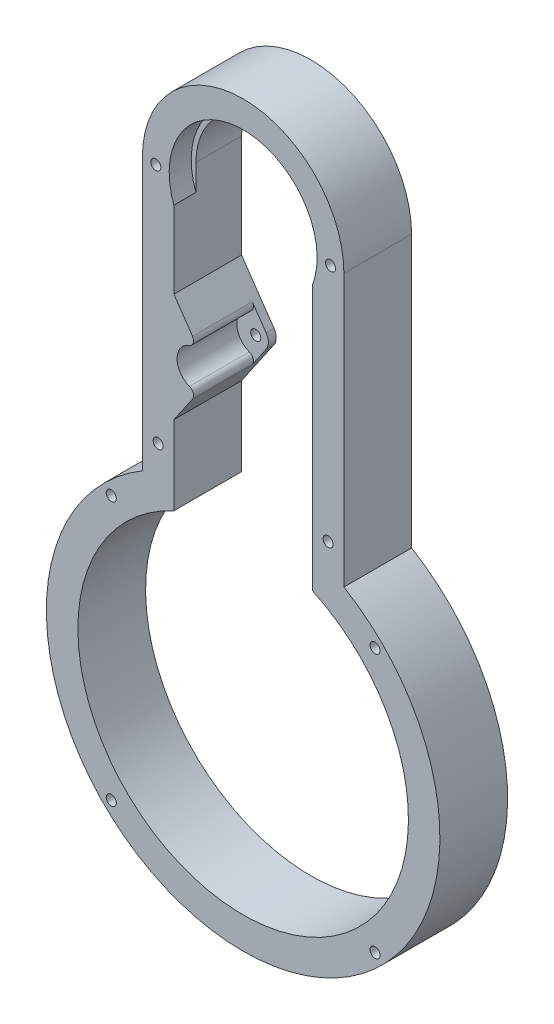
ISO-10303-21;
HEADER;
FILE_DESCRIPTION(('STEP AP214'),'2;1');
FILE_NAME('part.step','',(''),(''),'','','');
FILE_SCHEMA(('AUTOMOTIVE_DESIGN { 1 0 10303 214 1 1 1 1 }'));
ENDSEC;
DATA;
#1=APPLICATION_CONTEXT('core data for automotive mechanical design processes');
#2=APPLICATION_PROTOCOL_DEFINITION('international standard','automotive_design',2000,#1);
#3=PRODUCT_CONTEXT('',#1,'mechanical');
#4=PRODUCT('Part','Part','',(#3));
#5=PRODUCT_RELATED_PRODUCT_CATEGORY('part','',(#4));
#6=PRODUCT_DEFINITION_FORMATION('','',#4);
#7=PRODUCT_DEFINITION_CONTEXT('part definition',#1,'design');
#8=PRODUCT_DEFINITION('design','',#6,#7);
#9=PRODUCT_DEFINITION_SHAPE('','',#8);
#10=(LENGTH_UNIT() NAMED_UNIT(*) SI_UNIT(.MILLI.,.METRE.));
#11=(NAMED_UNIT(*) PLANE_ANGLE_UNIT() SI_UNIT($,.RADIAN.));
#12=(NAMED_UNIT(*) SI_UNIT($,.STERADIAN.) SOLID_ANGLE_UNIT());
#13=UNCERTAINTY_MEASURE_WITH_UNIT(LENGTH_MEASURE(1.E-05),#10,'distance_accuracy_value','');
#14=(GEOMETRIC_REPRESENTATION_CONTEXT(3) GLOBAL_UNCERTAINTY_ASSIGNED_CONTEXT((#13)) GLOBAL_UNIT_ASSIGNED_CONTEXT((#10,
#11,#12)) REPRESENTATION_CONTEXT('',''));
#15=CARTESIAN_POINT('',(0.,0.,0.));
#16=DIRECTION('',(0.,0.,1.));
#17=DIRECTION('',(1.,0.,0.));
#18=AXIS2_PLACEMENT_3D('',#15,#16,#17);
#19=CARTESIAN_POINT('',(-22.0000000000008,-132.331876479146,-287.235300628274));
#20=DIRECTION('',(1.,0.,0.));
#21=DIRECTION('',(0.,1.,0.));
#22=AXIS2_PLACEMENT_3D('',#19,#20,#21);
#23=PLANE('',#22);
#24=DIRECTION('',(0.,-1.,0.));
#25=VECTOR('',#24,1.);
#26=CARTESIAN_POINT('',(-22.0000000000008,-132.331876479146,0.));
#27=LINE('',#26,#25);
#28=CARTESIAN_POINT('',(-22.0000000000008,-107.263903455659,0.));
#29=VERTEX_POINT('',#28);
#30=CARTESIAN_POINT('',(-22.0000000000008,-132.331876479147,0.));
#31=VERTEX_POINT('',#30);
#32=EDGE_CURVE('E201',#29,#31,#27,.T.);
#33=ORIENTED_EDGE('',*,*,#32,.T.);
#34=DIRECTION('',(0.,0.,1.));
#35=VECTOR('',#34,1.);
#36=CARTESIAN_POINT('',(-22.0000000000008,-132.331876479147,-287.235300628274));
#37=LINE('',#36,#35);
#38=CARTESIAN_POINT('',(-22.0000000000008,-132.331876479146,-21.4999999999994));
#39=VERTEX_POINT('',#38);
#40=EDGE_CURVE('E239',#39,#31,#37,.T.);
#41=ORIENTED_EDGE('',*,*,#40,.F.);
#42=DIRECTION('',(0.,1.,0.));
#43=VECTOR('',#42,1.);
#44=CARTESIAN_POINT('',(-22.0000000000008,-132.331876479146,-21.4999999999995));
#45=LINE('',#44,#43);
#46=CARTESIAN_POINT('',(-22.0000000000008,-107.263903455659,-21.4999999999996));
#47=VERTEX_POINT('',#46);
#48=EDGE_CURVE('E262',#39,#47,#45,.T.);
#49=ORIENTED_EDGE('',*,*,#48,.T.);
#50=DIRECTION('',(0.,0.,-1.));
#51=VECTOR('',#50,1.);
#52=CARTESIAN_POINT('',(-22.0000000000008,-107.263903455659,36.2376799768453));
#53=LINE('',#52,#51);
#54=EDGE_CURVE('E346',#29,#47,#53,.T.);
#55=ORIENTED_EDGE('',*,*,#54,.F.);
#56=EDGE_LOOP('',(#33,#41,#49,#55));
#57=FACE_BOUND('',#56,.T.);
#58=ADVANCED_FACE('F49',(#57),#23,.T.);
#59=CARTESIAN_POINT('',(-8.38206200899663E-13,-180.000000000007,0.));
#60=DIRECTION('',(0.,0.,-1.));
#61=DIRECTION('',(1.,0.,0.));
#62=AXIS2_PLACEMENT_3D('',#59,#60,#61);
#63=PLANE('',#62);
#64=CARTESIAN_POINT('',(-27.0000000000008,-116.313409495487,0.));
#65=DIRECTION('',(0.,0.,-1.));
#66=DIRECTION('',(-1.,0.,0.));
#67=AXIS2_PLACEMENT_3D('',#64,#65,#66);
#68=CIRCLE('',#67,1.60000000000001);
#69=CARTESIAN_POINT('',(-28.6000000000009,-116.313409495487,0.));
#70=VERTEX_POINT('',#69);
#71=EDGE_CURVE('E505',#70,#70,#68,.T.);
#72=ORIENTED_EDGE('',*,*,#71,.T.);
#73=EDGE_LOOP('',(#72));
#74=FACE_BOUND('',#73,.T.);
#75=CARTESIAN_POINT('',(27.7500000000008,-40.0000000000076,0.));
#76=DIRECTION('',(0.,0.,-1.));
#77=DIRECTION('',(1.,0.,0.));
#78=AXIS2_PLACEMENT_3D('',#75,#76,#77);
#79=CIRCLE('',#78,1.60000000000009);
#80=CARTESIAN_POINT('',(29.3500000000008,-40.0000000000076,0.));
#81=VERTEX_POINT('',#80);
#82=EDGE_CURVE('E501',#81,#81,#79,.T.);
#83=ORIENTED_EDGE('',*,*,#82,.T.);
#84=EDGE_LOOP('',(#83));
#85=FACE_BOUND('',#84,.T.);
#86=CARTESIAN_POINT('',(27.0000000000008,-116.313409495487,0.));
#87=DIRECTION('',(0.,0.,-1.));
#88=DIRECTION('',(1.,0.,0.));
#89=AXIS2_PLACEMENT_3D('',#86,#87,#88);
#90=CIRCLE('',#89,1.60000000000001);
#91=CARTESIAN_POINT('',(28.6000000000008,-116.313409495487,0.));
#92=VERTEX_POINT('',#91);
#93=EDGE_CURVE('E493',#92,#92,#90,.T.);
#94=ORIENTED_EDGE('',*,*,#93,.T.);
#95=EDGE_LOOP('',(#94));
#96=FACE_BOUND('',#95,.T.);
#97=CARTESIAN_POINT('',(-27.7500000000008,-40.0000000000076,0.));
#98=DIRECTION('',(0.,0.,-1.));
#99=DIRECTION('',(-1.,0.,0.));
#100=AXIS2_PLACEMENT_3D('',#97,#98,#99);
#101=CIRCLE('',#100,1.60000000000008);
#102=CARTESIAN_POINT('',(-29.3500000000008,-40.0000000000076,0.));
#103=VERTEX_POINT('',#102);
#104=EDGE_CURVE('E509',#103,#103,#101,.T.);
#105=ORIENTED_EDGE('',*,*,#104,.T.);
#106=EDGE_LOOP('',(#105));
#107=FACE_BOUND('',#106,.T.);
#108=CARTESIAN_POINT('',(-41.8960767853039,-138.103923214704,0.));
#109=DIRECTION('',(0.,0.,-1.));
#110=DIRECTION('',(-1.,0.,0.));
#111=AXIS2_PLACEMENT_3D('',#108,#109,#110);
#112=CIRCLE('',#111,1.59999999999988);
#113=CARTESIAN_POINT('',(-43.4960767853038,-138.103923214704,0.));
#114=VERTEX_POINT('',#113);
#115=EDGE_CURVE('E542',#114,#114,#112,.T.);
#116=ORIENTED_EDGE('',*,*,#115,.T.);
#117=EDGE_LOOP('',(#116));
#118=FACE_BOUND('',#117,.T.);
#119=CARTESIAN_POINT('',(41.8960767853019,-138.103923214704,0.));
#120=DIRECTION('',(0.,0.,-1.));
#121=DIRECTION('',(-1.,0.,0.));
#122=AXIS2_PLACEMENT_3D('',#119,#120,#121);
#123=CIRCLE('',#122,1.59999999999983);
#124=CARTESIAN_POINT('',(40.2960767853021,-138.103923214704,0.));
#125=VERTEX_POINT('',#124);
#126=EDGE_CURVE('E534',#125,#125,#123,.T.);
#127=ORIENTED_EDGE('',*,*,#126,.T.);
#128=EDGE_LOOP('',(#127));
#129=FACE_BOUND('',#128,.T.);
#130=CARTESIAN_POINT('',(41.896076785302,-221.89607678531,0.));
#131=DIRECTION('',(0.,0.,-1.));
#132=DIRECTION('',(-1.,0.,0.));
#133=AXIS2_PLACEMENT_3D('',#130,#131,#132);
#134=CIRCLE('',#133,1.59999999999994);
#135=CARTESIAN_POINT('',(40.296076785302,-221.89607678531,0.));
#136=VERTEX_POINT('',#135);
#137=EDGE_CURVE('E525',#136,#136,#134,.T.);
#138=ORIENTED_EDGE('',*,*,#137,.T.);
#139=EDGE_LOOP('',(#138));
#140=FACE_BOUND('',#139,.T.);
#141=CARTESIAN_POINT('',(-41.8960767853039,-221.89607678531,0.));
#142=DIRECTION('',(0.,0.,-1.));
#143=DIRECTION('',(-1.,0.,0.));
#144=AXIS2_PLACEMENT_3D('',#141,#142,#143);
#145=CIRCLE('',#144,1.59999999999997);
#146=CARTESIAN_POINT('',(-43.4960767853039,-221.89607678531,0.));
#147=VERTEX_POINT('',#146);
#148=EDGE_CURVE('E529',#147,#147,#145,.T.);
#149=ORIENTED_EDGE('',*,*,#148,.T.);
#150=EDGE_LOOP('',(#149));
#151=FACE_BOUND('',#150,.T.);
#152=CARTESIAN_POINT('',(-8.38206200899663E-13,-180.000000000007,0.));
#153=DIRECTION('',(0.,0.,1.));
#154=DIRECTION('',(1.,0.,0.));
#155=AXIS2_PLACEMENT_3D('',#152,#153,#154);
#156=CIRCLE('',#155,62.5);
#157=CARTESIAN_POINT('',(-32.0000000000008,-126.313409495487,0.));
#158=VERTEX_POINT('',#157);
#159=CARTESIAN_POINT('',(31.9999999999991,-126.313409495487,0.));
#160=VERTEX_POINT('',#159);
#161=EDGE_CURVE('E234',#158,#160,#156,.T.);
#162=ORIENTED_EDGE('',*,*,#161,.T.);
#163=DIRECTION('',(0.,1.,0.));
#164=VECTOR('',#163,1.);
#165=CARTESIAN_POINT('',(31.9999999999991,-126.313409495487,0.));
#166=LINE('',#165,#164);
#167=CARTESIAN_POINT('',(31.9999999999992,-40.0000000000076,0.));
#168=VERTEX_POINT('',#167);
#169=EDGE_CURVE('E219',#160,#168,#166,.T.);
#170=ORIENTED_EDGE('',*,*,#169,.T.);
#171=CARTESIAN_POINT('',(-7.88993905312894E-13,-40.0000000000076,0.));
#172=DIRECTION('',(0.,0.,1.));
#173=DIRECTION('',(1.,0.,0.));
#174=AXIS2_PLACEMENT_3D('',#171,#172,#173);
#175=CIRCLE('',#174,32.);
#176=CARTESIAN_POINT('',(-32.0000000000008,-40.0000000000076,0.));
#177=VERTEX_POINT('',#176);
#178=EDGE_CURVE('E224',#168,#177,#175,.T.);
#179=ORIENTED_EDGE('',*,*,#178,.T.);
#180=DIRECTION('',(0.,-1.,0.));
#181=VECTOR('',#180,1.);
#182=CARTESIAN_POINT('',(-32.0000000000008,-126.313409495487,0.));
#183=LINE('',#182,#181);
#184=EDGE_CURVE('E229',#177,#158,#183,.T.);
#185=ORIENTED_EDGE('',*,*,#184,.T.);
#186=EDGE_LOOP('',(#162,#170,#179,#185));
#187=FACE_BOUND('',#186,.T.);
#188=DIRECTION('',(0.,1.,0.));
#189=VECTOR('',#188,1.);
#190=CARTESIAN_POINT('',(21.9999999999991,-132.331876479146,0.));
#191=LINE('',#190,#189);
#192=CARTESIAN_POINT('',(21.9999999999991,-132.331876479146,0.));
#193=VERTEX_POINT('',#192);
#194=CARTESIAN_POINT('',(21.9999999999992,-48.2613558209038,0.));
#195=VERTEX_POINT('',#194);
#196=EDGE_CURVE('E206',#193,#195,#191,.T.);
#197=ORIENTED_EDGE('',*,*,#196,.F.);
#198=CARTESIAN_POINT('',(-7.82933356390165E-13,-180.000000000006,0.));
#199=DIRECTION('',(0.,0.,1.));
#200=DIRECTION('',(1.,0.,0.));
#201=AXIS2_PLACEMENT_3D('',#198,#199,#200);
#202=CIRCLE('',#201,52.499999999999);
#203=EDGE_CURVE('E200',#31,#193,#202,.T.);
#204=ORIENTED_EDGE('',*,*,#203,.F.);
#205=ORIENTED_EDGE('',*,*,#32,.F.);
#206=DIRECTION('',(0.565975863912894,0.824421810402935,0.));
#207=VECTOR('',#206,1.);
#208=CARTESIAN_POINT('',(35.0968735930235,-24.0944418279578,0.));
#209=LINE('',#208,#207);
#210=CARTESIAN_POINT('',(-16.0863429489683,-98.6498473395408,0.));
#211=VERTEX_POINT('',#210);
#212=EDGE_CURVE('E334',#29,#211,#209,.T.);
#213=ORIENTED_EDGE('',*,*,#212,.T.);
#214=CARTESIAN_POINT('',(-17.7351865697742,-97.517895611715,0.));
#215=DIRECTION('',(0.,0.,1.));
#216=DIRECTION('',(1.,0.,0.));
#217=AXIS2_PLACEMENT_3D('',#214,#215,#216);
#218=CIRCLE('',#217,2.);
#219=CARTESIAN_POINT('',(-17.0513899273306,-95.6384217087882,0.));
#220=VERTEX_POINT('',#219);
#221=EDGE_CURVE('E286',#220,#211,#218,.F.);
#222=ORIENTED_EDGE('',*,*,#221,.F.);
#223=CARTESIAN_POINT('',(-15.,-90.0000000000078,0.));
#224=DIRECTION('',(0.,0.,-1.));
#225=DIRECTION('',(-1.,0.,0.));
#226=AXIS2_PLACEMENT_3D('',#223,#224,#225);
#227=CIRCLE('',#226,6.);
#228=CARTESIAN_POINT('',(-17.0513899273305,-84.3615782912273,0.));
#229=VERTEX_POINT('',#228);
#230=EDGE_CURVE('E311',#220,#229,#227,.T.);
#231=ORIENTED_EDGE('',*,*,#230,.T.);
#232=CARTESIAN_POINT('',(-17.735186569774,-82.4821043883005,0.));
#233=DIRECTION('',(0.,0.,1.));
#234=DIRECTION('',(1.,0.,0.));
#235=AXIS2_PLACEMENT_3D('',#232,#233,#234);
#236=CIRCLE('',#235,2.);
#237=CARTESIAN_POINT('',(-16.0863429489682,-81.3501526604747,0.));
#238=VERTEX_POINT('',#237);
#239=EDGE_CURVE('E282',#238,#229,#236,.F.);
#240=ORIENTED_EDGE('',*,*,#239,.F.);
#241=DIRECTION('',(0.565975863912896,-0.824421810402934,0.));
#242=VECTOR('',#241,1.);
#243=CARTESIAN_POINT('',(-48.8916387538416,-33.5647203077977,0.));
#244=LINE('',#243,#242);
#245=CARTESIAN_POINT('',(-22.0000000000008,-72.7360965443561,0.));
#246=VERTEX_POINT('',#245);
#247=EDGE_CURVE('E198',#246,#238,#244,.T.);
#248=ORIENTED_EDGE('',*,*,#247,.F.);
#249=CARTESIAN_POINT('',(-22.0000000000008,-48.2613558209349,0.));
#250=VERTEX_POINT('',#249);
#251=EDGE_CURVE('E179',#250,#246,#27,.T.);
#252=ORIENTED_EDGE('',*,*,#251,.F.);
#253=CARTESIAN_POINT('',(-6.62335602067315E-12,-40.0000000000068,0.));
#254=DIRECTION('',(0.,0.,-1.));
#255=DIRECTION('',(-1.,0.,0.));
#256=AXIS2_PLACEMENT_3D('',#253,#254,#255);
#257=CIRCLE('',#256,23.4999999999942);
#258=EDGE_CURVE('E187',#250,#195,#257,.T.);
#259=ORIENTED_EDGE('',*,*,#258,.T.);
#260=EDGE_LOOP('',(#197,#204,#205,#213,#222,#231,#240,#248,#252,#259));
#261=FACE_BOUND('',#260,.T.);
#262=ADVANCED_FACE('F195',(#74,#85,#96,#107,#118,#129,#140,#151,#187,#261),#63,.F.);
#263=CARTESIAN_POINT('',(-8.38206200899663E-13,-180.000000000007,-287.235300628274));
#264=DIRECTION('',(0.,0.,1.));
#265=DIRECTION('',(-1.,0.,0.));
#266=AXIS2_PLACEMENT_3D('',#263,#264,#265);
#267=CYLINDRICAL_SURFACE('',#266,62.5);
#268=DIRECTION('',(0.,0.,1.));
#269=VECTOR('',#268,1.);
#270=CARTESIAN_POINT('',(31.9999999999991,-126.313409495487,-287.235300628274));
#271=LINE('',#270,#269);
#272=CARTESIAN_POINT('',(31.9999999999991,-126.313409495487,-21.4999999999995));
#273=VERTEX_POINT('',#272);
#274=EDGE_CURVE('E216',#273,#160,#271,.T.);
#275=ORIENTED_EDGE('',*,*,#274,.T.);
#276=ORIENTED_EDGE('',*,*,#161,.F.);
#277=DIRECTION('',(0.,0.,1.));
#278=VECTOR('',#277,1.);
#279=CARTESIAN_POINT('',(-32.0000000000008,-126.313409495487,-287.235300628274));
#280=LINE('',#279,#278);
#281=CARTESIAN_POINT('',(-32.0000000000008,-126.313409495487,-21.4999999999995));
#282=VERTEX_POINT('',#281);
#283=EDGE_CURVE('E231',#282,#158,#280,.T.);
#284=ORIENTED_EDGE('',*,*,#283,.F.);
#285=CARTESIAN_POINT('',(-8.38206200899663E-13,-180.000000000007,-21.4999999999994));
#286=DIRECTION('',(0.,0.,-1.));
#287=DIRECTION('',(0.,1.,0.));
#288=AXIS2_PLACEMENT_3D('',#285,#286,#287);
#289=CIRCLE('',#288,62.5);
#290=EDGE_CURVE('E235',#273,#282,#289,.T.);
#291=ORIENTED_EDGE('',*,*,#290,.F.);
#292=EDGE_LOOP('',(#275,#276,#284,#291));
#293=FACE_BOUND('',#292,.T.);
#294=ADVANCED_FACE('F406',(#293),#267,.T.);
#295=CARTESIAN_POINT('',(31.9999999999991,-126.313409495487,-287.235300628274));
#296=DIRECTION('',(-1.,0.,0.));
#297=DIRECTION('',(0.,-1.,0.));
#298=AXIS2_PLACEMENT_3D('',#295,#296,#297);
#299=PLANE('',#298);
#300=DIRECTION('',(0.,0.,1.));
#301=VECTOR('',#300,1.);
#302=CARTESIAN_POINT('',(31.9999999999992,-40.0000000000076,-287.235300628274));
#303=LINE('',#302,#301);
#304=CARTESIAN_POINT('',(31.9999999999992,-40.0000000000076,-21.4999999999996));
#305=VERTEX_POINT('',#304);
#306=EDGE_CURVE('E221',#305,#168,#303,.T.);
#307=ORIENTED_EDGE('',*,*,#306,.T.);
#308=ORIENTED_EDGE('',*,*,#169,.F.);
#309=ORIENTED_EDGE('',*,*,#274,.F.);
#310=DIRECTION('',(0.,-1.,0.));
#311=VECTOR('',#310,1.);
#312=CARTESIAN_POINT('',(31.9999999999991,-126.313409495487,-21.4999999999995));
#313=LINE('',#312,#311);
#314=EDGE_CURVE('E220',#305,#273,#313,.T.);
#315=ORIENTED_EDGE('',*,*,#314,.F.);
#316=EDGE_LOOP('',(#307,#308,#309,#315));
#317=FACE_BOUND('',#316,.T.);
#318=ADVANCED_FACE('F417',(#317),#299,.F.);
#319=CARTESIAN_POINT('',(-7.88993905312894E-13,-40.0000000000076,-287.235300628274));
#320=DIRECTION('',(0.,0.,1.));
#321=DIRECTION('',(-1.,0.,0.));
#322=AXIS2_PLACEMENT_3D('',#319,#320,#321);
#323=CYLINDRICAL_SURFACE('',#322,32.);
#324=DIRECTION('',(0.,0.,1.));
#325=VECTOR('',#324,1.);
#326=CARTESIAN_POINT('',(-32.0000000000008,-40.0000000000076,-287.235300628274));
#327=LINE('',#326,#325);
#328=CARTESIAN_POINT('',(-32.0000000000008,-40.0000000000076,-21.4999999999995));
#329=VERTEX_POINT('',#328);
#330=EDGE_CURVE('E226',#329,#177,#327,.T.);
#331=ORIENTED_EDGE('',*,*,#330,.T.);
#332=ORIENTED_EDGE('',*,*,#178,.F.);
#333=ORIENTED_EDGE('',*,*,#306,.F.);
#334=CARTESIAN_POINT('',(-7.88993905312894E-13,-40.0000000000076,-21.4999999999996));
#335=DIRECTION('',(0.,0.,-1.));
#336=DIRECTION('',(0.,1.,0.));
#337=AXIS2_PLACEMENT_3D('',#334,#335,#336);
#338=CIRCLE('',#337,32.);
#339=EDGE_CURVE('E225',#329,#305,#338,.T.);
#340=ORIENTED_EDGE('',*,*,#339,.F.);
#341=EDGE_LOOP('',(#331,#332,#333,#340));
#342=FACE_BOUND('',#341,.T.);
#343=ADVANCED_FACE('F397',(#342),#323,.T.);
#344=CARTESIAN_POINT('',(-32.0000000000008,-126.313409495487,-287.235300628274));
#345=DIRECTION('',(1.,0.,0.));
#346=DIRECTION('',(0.,1.,0.));
#347=AXIS2_PLACEMENT_3D('',#344,#345,#346);
#348=PLANE('',#347);
#349=ORIENTED_EDGE('',*,*,#283,.T.);
#350=ORIENTED_EDGE('',*,*,#184,.F.);
#351=ORIENTED_EDGE('',*,*,#330,.F.);
#352=DIRECTION('',(0.,1.,0.));
#353=VECTOR('',#352,1.);
#354=CARTESIAN_POINT('',(-32.0000000000008,-126.313409495487,-21.4999999999995));
#355=LINE('',#354,#353);
#356=EDGE_CURVE('E230',#282,#329,#355,.T.);
#357=ORIENTED_EDGE('',*,*,#356,.F.);
#358=EDGE_LOOP('',(#349,#350,#351,#357));
#359=FACE_BOUND('',#358,.T.);
#360=ADVANCED_FACE('F389',(#359),#348,.F.);
#361=CARTESIAN_POINT('',(-7.83065447428345E-13,-40.0000000000076,-287.235300628274));
#362=DIRECTION('',(0.,0.,1.));
#363=DIRECTION('',(-1.,0.,0.));
#364=AXIS2_PLACEMENT_3D('',#361,#362,#363);
#365=CYLINDRICAL_SURFACE('',#364,22.);
#366=CARTESIAN_POINT('',(-7.83065447428345E-13,-40.0000000000076,-6.99999999999967));
#367=DIRECTION('',(0.,0.,1.));
#368=DIRECTION('',(1.,0.,0.));
#369=AXIS2_PLACEMENT_3D('',#366,#367,#368);
#370=CIRCLE('',#369,22.);
#371=CARTESIAN_POINT('',(21.9999999999992,-40.0000000000076,-6.9999999999997));
#372=VERTEX_POINT('',#371);
#373=CARTESIAN_POINT('',(-22.0000000000008,-40.0000000000076,-6.99999999999963));
#374=VERTEX_POINT('',#373);
#375=EDGE_CURVE('E184',#372,#374,#370,.T.);
#376=ORIENTED_EDGE('',*,*,#375,.T.);
#377=DIRECTION('',(0.,0.,1.));
#378=VECTOR('',#377,1.);
#379=CARTESIAN_POINT('',(-22.0000000000008,-40.0000000000076,-287.235300628274));
#380=LINE('',#379,#378);
#381=CARTESIAN_POINT('',(-22.0000000000008,-40.0000000000076,-21.4999999999996));
#382=VERTEX_POINT('',#381);
#383=EDGE_CURVE('E236',#382,#374,#380,.T.);
#384=ORIENTED_EDGE('',*,*,#383,.F.);
#385=CARTESIAN_POINT('',(-7.83065447428345E-13,-40.0000000000076,-21.4999999999996));
#386=DIRECTION('',(0.,0.,-1.));
#387=DIRECTION('',(0.,1.,0.));
#388=AXIS2_PLACEMENT_3D('',#385,#386,#387);
#389=CIRCLE('',#388,22.);
#390=CARTESIAN_POINT('',(21.9999999999992,-40.0000000000076,-21.4999999999995));
#391=VERTEX_POINT('',#390);
#392=EDGE_CURVE('E215',#382,#391,#389,.T.);
#393=ORIENTED_EDGE('',*,*,#392,.T.);
#394=DIRECTION('',(0.,0.,1.));
#395=VECTOR('',#394,1.);
#396=CARTESIAN_POINT('',(21.9999999999992,-40.0000000000076,-287.235300628274));
#397=LINE('',#396,#395);
#398=EDGE_CURVE('E246',#391,#372,#397,.T.);
#399=ORIENTED_EDGE('',*,*,#398,.T.);
#400=EDGE_LOOP('',(#376,#384,#393,#399));
#401=FACE_BOUND('',#400,.T.);
#402=ADVANCED_FACE('F387',(#401),#365,.F.);
#403=DIRECTION('',(0.,-1.,0.));
#404=VECTOR('',#403,1.);
#405=CARTESIAN_POINT('',(-22.0000000000008,-132.331876479146,-6.99999999999956));
#406=LINE('',#405,#404);
#407=CARTESIAN_POINT('',(-22.0000000000008,-48.2613558209349,-6.99999999999961));
#408=VERTEX_POINT('',#407);
#409=EDGE_CURVE('E182',#374,#408,#406,.T.);
#410=ORIENTED_EDGE('',*,*,#409,.T.);
#411=DIRECTION('',(0.,0.,1.));
#412=VECTOR('',#411,1.);
#413=CARTESIAN_POINT('',(-22.0000000000008,-48.2613558209349,-73.4680374315186));
#414=LINE('',#413,#412);
#415=EDGE_CURVE('E175',#408,#250,#414,.T.);
#416=ORIENTED_EDGE('',*,*,#415,.T.);
#417=ORIENTED_EDGE('',*,*,#251,.T.);
#418=DIRECTION('',(0.,0.,-1.));
#419=VECTOR('',#418,1.);
#420=CARTESIAN_POINT('',(-22.0000000000008,-72.7360965443561,36.2376799768453));
#421=LINE('',#420,#419);
#422=CARTESIAN_POINT('',(-22.0000000000008,-72.7360965443561,-21.4999999999995));
#423=VERTEX_POINT('',#422);
#424=EDGE_CURVE('E352',#246,#423,#421,.T.);
#425=ORIENTED_EDGE('',*,*,#424,.T.);
#426=EDGE_CURVE('E267',#423,#382,#45,.T.);
#427=ORIENTED_EDGE('',*,*,#426,.T.);
#428=ORIENTED_EDGE('',*,*,#383,.T.);
#429=EDGE_LOOP('',(#410,#416,#417,#425,#427,#428));
#430=FACE_BOUND('',#429,.T.);
#431=ADVANCED_FACE('F176',(#430),#23,.T.);
#432=CARTESIAN_POINT('',(-7.82933356390165E-13,-180.000000000006,-287.235300628274));
#433=DIRECTION('',(0.,0.,1.));
#434=DIRECTION('',(-1.,0.,0.));
#435=AXIS2_PLACEMENT_3D('',#432,#433,#434);
#436=CYLINDRICAL_SURFACE('',#435,52.499999999999);
#437=CARTESIAN_POINT('',(-7.82933356390165E-13,-180.000000000006,-21.4999999999994));
#438=DIRECTION('',(0.,0.,-1.));
#439=DIRECTION('',(0.,1.,0.));
#440=AXIS2_PLACEMENT_3D('',#437,#438,#439);
#441=CIRCLE('',#440,52.499999999999);
#442=CARTESIAN_POINT('',(21.9999999999991,-132.331876479146,-21.4999999999995));
#443=VERTEX_POINT('',#442);
#444=EDGE_CURVE('E214',#443,#39,#441,.T.);
#445=ORIENTED_EDGE('',*,*,#444,.T.);
#446=ORIENTED_EDGE('',*,*,#40,.T.);
#447=ORIENTED_EDGE('',*,*,#203,.T.);
#448=DIRECTION('',(0.,0.,1.));
#449=VECTOR('',#448,1.);
#450=CARTESIAN_POINT('',(21.9999999999991,-132.331876479146,-287.235300628274));
#451=LINE('',#450,#449);
#452=EDGE_CURVE('E243',#443,#193,#451,.T.);
#453=ORIENTED_EDGE('',*,*,#452,.F.);
#454=EDGE_LOOP('',(#445,#446,#447,#453));
#455=FACE_BOUND('',#454,.T.);
#456=ADVANCED_FACE('F395',(#455),#436,.F.);
#457=CARTESIAN_POINT('',(21.9999999999991,-132.331876479146,-287.235300628274));
#458=DIRECTION('',(-1.,0.,0.));
#459=DIRECTION('',(0.,-1.,0.));
#460=AXIS2_PLACEMENT_3D('',#457,#458,#459);
#461=PLANE('',#460);
#462=DIRECTION('',(0.,1.,0.));
#463=VECTOR('',#462,1.);
#464=CARTESIAN_POINT('',(21.9999999999991,-132.331876479146,-6.99999999999962));
#465=LINE('',#464,#463);
#466=CARTESIAN_POINT('',(21.9999999999992,-48.2613558209038,-6.99999999999969));
#467=VERTEX_POINT('',#466);
#468=EDGE_CURVE('E11',#467,#372,#465,.T.);
#469=ORIENTED_EDGE('',*,*,#468,.T.);
#470=ORIENTED_EDGE('',*,*,#398,.F.);
#471=DIRECTION('',(0.,-1.,0.));
#472=VECTOR('',#471,1.);
#473=CARTESIAN_POINT('',(21.9999999999991,-132.331876479146,-21.4999999999995));
#474=LINE('',#473,#472);
#475=EDGE_CURVE('E211',#391,#443,#474,.T.);
#476=ORIENTED_EDGE('',*,*,#475,.T.);
#477=ORIENTED_EDGE('',*,*,#452,.T.);
#478=ORIENTED_EDGE('',*,*,#196,.T.);
#479=DIRECTION('',(0.,0.,1.));
#480=VECTOR('',#479,1.);
#481=CARTESIAN_POINT('',(21.9999999999992,-48.2613558209038,-73.4680374315186));
#482=LINE('',#481,#480);
#483=EDGE_CURVE('E58',#195,#467,#482,.F.);
#484=ORIENTED_EDGE('',*,*,#483,.T.);
#485=EDGE_LOOP('',(#469,#470,#476,#477,#478,#484));
#486=FACE_BOUND('',#485,.T.);
#487=ADVANCED_FACE('F300',(#486),#461,.T.);
#488=CARTESIAN_POINT('',(-44.1941738241602,-224.194173824166,-21.4999999999993));
#489=DIRECTION('',(0.,0.,1.));
#490=DIRECTION('',(0.707106781186547,-0.707106781186548,0.));
#491=AXIS2_PLACEMENT_3D('',#488,#489,#490);
#492=PLANE('',#491);
#493=CARTESIAN_POINT('',(-27.0000000000008,-116.313409495487,-21.4999999999996));
#494=DIRECTION('',(0.,0.,-1.));
#495=DIRECTION('',(-1.,0.,0.));
#496=AXIS2_PLACEMENT_3D('',#493,#494,#495);
#497=CIRCLE('',#496,1.60000000000001);
#498=CARTESIAN_POINT('',(-28.6000000000009,-116.313409495487,-21.4999999999996));
#499=VERTEX_POINT('',#498);
#500=EDGE_CURVE('E510',#499,#499,#497,.T.);
#501=ORIENTED_EDGE('',*,*,#500,.F.);
#502=EDGE_LOOP('',(#501));
#503=FACE_BOUND('',#502,.T.);
#504=CARTESIAN_POINT('',(27.7500000000008,-40.0000000000076,-21.4999999999996));
#505=DIRECTION('',(0.,0.,-1.));
#506=DIRECTION('',(1.,0.,0.));
#507=AXIS2_PLACEMENT_3D('',#504,#505,#506);
#508=CIRCLE('',#507,1.60000000000009);
#509=CARTESIAN_POINT('',(29.3500000000008,-40.0000000000076,-21.4999999999996));
#510=VERTEX_POINT('',#509);
#511=EDGE_CURVE('E496',#510,#510,#508,.T.);
#512=ORIENTED_EDGE('',*,*,#511,.F.);
#513=EDGE_LOOP('',(#512));
#514=FACE_BOUND('',#513,.T.);
#515=CARTESIAN_POINT('',(27.0000000000008,-116.313409495487,-21.4999999999996));
#516=DIRECTION('',(0.,0.,-1.));
#517=DIRECTION('',(1.,0.,0.));
#518=AXIS2_PLACEMENT_3D('',#515,#516,#517);
#519=CIRCLE('',#518,1.60000000000001);
#520=CARTESIAN_POINT('',(28.6000000000008,-116.313409495487,-21.4999999999996));
#521=VERTEX_POINT('',#520);
#522=EDGE_CURVE('E490',#521,#521,#519,.T.);
#523=ORIENTED_EDGE('',*,*,#522,.F.);
#524=EDGE_LOOP('',(#523));
#525=FACE_BOUND('',#524,.T.);
#526=CARTESIAN_POINT('',(-27.7500000000008,-40.0000000000076,-21.4999999999996));
#527=DIRECTION('',(0.,0.,-1.));
#528=DIRECTION('',(-1.,0.,0.));
#529=AXIS2_PLACEMENT_3D('',#526,#527,#528);
#530=CIRCLE('',#529,1.60000000000008);
#531=CARTESIAN_POINT('',(-29.3500000000008,-40.0000000000076,-21.4999999999996));
#532=VERTEX_POINT('',#531);
#533=EDGE_CURVE('E517',#532,#532,#530,.T.);
#534=ORIENTED_EDGE('',*,*,#533,.F.);
#535=EDGE_LOOP('',(#534));
#536=FACE_BOUND('',#535,.T.);
#537=CARTESIAN_POINT('',(-41.8960767853039,-138.103923214704,-21.4999999999996));
#538=DIRECTION('',(0.,0.,-1.));
#539=DIRECTION('',(-1.,0.,0.));
#540=AXIS2_PLACEMENT_3D('',#537,#538,#539);
#541=CIRCLE('',#540,1.59999999999988);
#542=CARTESIAN_POINT('',(-43.4960767853038,-138.103923214704,-21.4999999999996));
#543=VERTEX_POINT('',#542);
#544=EDGE_CURVE('E521',#543,#543,#541,.T.);
#545=ORIENTED_EDGE('',*,*,#544,.F.);
#546=EDGE_LOOP('',(#545));
#547=FACE_BOUND('',#546,.T.);
#548=CARTESIAN_POINT('',(41.8960767853019,-138.103923214704,-21.4999999999996));
#549=DIRECTION('',(0.,0.,-1.));
#550=DIRECTION('',(-1.,0.,0.));
#551=AXIS2_PLACEMENT_3D('',#548,#549,#550);
#552=CIRCLE('',#551,1.59999999999983);
#553=CARTESIAN_POINT('',(40.2960767853021,-138.103923214704,-21.4999999999996));
#554=VERTEX_POINT('',#553);
#555=EDGE_CURVE('E538',#554,#554,#552,.T.);
#556=ORIENTED_EDGE('',*,*,#555,.F.);
#557=EDGE_LOOP('',(#556));
#558=FACE_BOUND('',#557,.T.);
#559=CARTESIAN_POINT('',(41.896076785302,-221.89607678531,-21.4999999999996));
#560=DIRECTION('',(0.,0.,-1.));
#561=DIRECTION('',(-1.,0.,0.));
#562=AXIS2_PLACEMENT_3D('',#559,#560,#561);
#563=CIRCLE('',#562,1.59999999999994);
#564=CARTESIAN_POINT('',(40.296076785302,-221.89607678531,-21.4999999999996));
#565=VERTEX_POINT('',#564);
#566=EDGE_CURVE('E530',#565,#565,#563,.T.);
#567=ORIENTED_EDGE('',*,*,#566,.F.);
#568=EDGE_LOOP('',(#567));
#569=FACE_BOUND('',#568,.T.);
#570=CARTESIAN_POINT('',(-41.8960767853039,-221.89607678531,-21.4999999999996));
#571=DIRECTION('',(0.,0.,-1.));
#572=DIRECTION('',(-1.,0.,0.));
#573=AXIS2_PLACEMENT_3D('',#570,#571,#572);
#574=CIRCLE('',#573,1.59999999999997);
#575=CARTESIAN_POINT('',(-43.4960767853039,-221.89607678531,-21.4999999999996));
#576=VERTEX_POINT('',#575);
#577=EDGE_CURVE('E193',#576,#576,#574,.T.);
#578=ORIENTED_EDGE('',*,*,#577,.F.);
#579=EDGE_LOOP('',(#578));
#580=FACE_BOUND('',#579,.T.);
#581=ORIENTED_EDGE('',*,*,#392,.F.);
#582=ORIENTED_EDGE('',*,*,#426,.F.);
#583=DIRECTION('',(-0.565975863912896,0.824421810402934,0.));
#584=VECTOR('',#583,1.);
#585=CARTESIAN_POINT('',(-48.8916387538416,-33.5647203077977,-21.4999999999996));
#586=LINE('',#585,#584);
#587=CARTESIAN_POINT('',(-11.7023127583883,-87.736096544356,-21.4999999999996));
#588=VERTEX_POINT('',#587);
#589=EDGE_CURVE('E335',#588,#423,#586,.T.);
#590=ORIENTED_EDGE('',*,*,#589,.F.);
#591=CARTESIAN_POINT('',(-15.,-90.0000000000076,-21.4999999999996));
#592=DIRECTION('',(0.,0.,1.));
#593=DIRECTION('',(1.,0.,0.));
#594=AXIS2_PLACEMENT_3D('',#591,#592,#593);
#595=CIRCLE('',#594,4.00000000000001);
#596=CARTESIAN_POINT('',(-11.7023127583883,-92.2639034556592,-21.4999999999996));
#597=VERTEX_POINT('',#596);
#598=EDGE_CURVE('E338',#597,#588,#595,.T.);
#599=ORIENTED_EDGE('',*,*,#598,.F.);
#600=DIRECTION('',(-0.565975863912895,-0.824421810402935,0.));
#601=VECTOR('',#600,1.);
#602=CARTESIAN_POINT('',(35.0968735930235,-24.0944418279578,-21.4999999999996));
#603=LINE('',#602,#601);
#604=EDGE_CURVE('E343',#597,#47,#603,.T.);
#605=ORIENTED_EDGE('',*,*,#604,.T.);
#606=ORIENTED_EDGE('',*,*,#48,.F.);
#607=ORIENTED_EDGE('',*,*,#444,.F.);
#608=ORIENTED_EDGE('',*,*,#475,.F.);
#609=EDGE_LOOP('',(#581,#582,#590,#599,#605,#606,#607,#608));
#610=FACE_BOUND('',#609,.T.);
#611=ORIENTED_EDGE('',*,*,#314,.T.);
#612=ORIENTED_EDGE('',*,*,#290,.T.);
#613=ORIENTED_EDGE('',*,*,#356,.T.);
#614=ORIENTED_EDGE('',*,*,#339,.T.);
#615=EDGE_LOOP('',(#611,#612,#613,#614));
#616=FACE_BOUND('',#615,.T.);
#617=CARTESIAN_POINT('',(-15.,-90.0000000000076,-21.4999999999996));
#618=DIRECTION('',(0.,0.,1.));
#619=DIRECTION('',(1.,0.,0.));
#620=AXIS2_PLACEMENT_3D('',#617,#618,#619);
#621=CIRCLE('',#620,1.6);
#622=CARTESIAN_POINT('',(-13.4,-90.0000000000076,-21.4999999999996));
#623=VERTEX_POINT('',#622);
#624=EDGE_CURVE('E348',#623,#623,#621,.T.);
#625=ORIENTED_EDGE('',*,*,#624,.T.);
#626=EDGE_LOOP('',(#625));
#627=FACE_BOUND('',#626,.T.);
#628=ADVANCED_FACE('F384',(#503,#514,#525,#536,#547,#558,#569,#580,#610,#616,#627),#492,.F.);
#629=CARTESIAN_POINT('',(35.0968735930235,-24.0944418279578,36.2376799768453));
#630=DIRECTION('',(-0.824421810402935,0.565975863912894,0.));
#631=DIRECTION('',(-0.565975863912894,-0.824421810402935,0.));
#632=AXIS2_PLACEMENT_3D('',#629,#630,#631);
#633=PLANE('',#632);
#634=ORIENTED_EDGE('',*,*,#212,.F.);
#635=ORIENTED_EDGE('',*,*,#54,.T.);
#636=ORIENTED_EDGE('',*,*,#604,.F.);
#637=DIRECTION('',(0.,0.,-1.));
#638=VECTOR('',#637,1.);
#639=CARTESIAN_POINT('',(-11.7023127583883,-92.2639034556592,36.2376799768453));
#640=LINE('',#639,#638);
#641=CARTESIAN_POINT('',(-11.7023127583883,-92.2639034556592,-19.0000000000001));
#642=VERTEX_POINT('',#641);
#643=EDGE_CURVE('E347',#642,#597,#640,.T.);
#644=ORIENTED_EDGE('',*,*,#643,.F.);
#645=DIRECTION('',(0.565975863912894,0.824421810402935,0.));
#646=VECTOR('',#645,1.);
#647=CARTESIAN_POINT('',(35.0968735930234,-24.0944418279579,-19.0000000000003));
#648=LINE('',#647,#646);
#649=CARTESIAN_POINT('',(-16.0863429489683,-98.6498473395408,-19.));
#650=VERTEX_POINT('',#649);
#651=EDGE_CURVE('E326',#650,#642,#648,.T.);
#652=ORIENTED_EDGE('',*,*,#651,.F.);
#653=DIRECTION('',(0.,0.,1.));
#654=VECTOR('',#653,1.);
#655=CARTESIAN_POINT('',(-16.0863429489683,-98.6498473395408,36.2376799768453));
#656=LINE('',#655,#654);
#657=EDGE_CURVE('E272',#211,#650,#656,.F.);
#658=ORIENTED_EDGE('',*,*,#657,.F.);
#659=EDGE_LOOP('',(#634,#635,#636,#644,#652,#658));
#660=FACE_BOUND('',#659,.T.);
#661=ADVANCED_FACE('F425',(#660),#633,.F.);
#662=CARTESIAN_POINT('',(-48.8916387538416,-33.5647203077977,36.2376799768453));
#663=DIRECTION('',(0.824421810402934,0.565975863912896,0.));
#664=DIRECTION('',(-0.565975863912896,0.824421810402934,0.));
#665=AXIS2_PLACEMENT_3D('',#662,#663,#664);
#666=PLANE('',#665);
#667=DIRECTION('',(0.565975863912896,-0.824421810402934,0.));
#668=VECTOR('',#667,1.);
#669=CARTESIAN_POINT('',(-48.8916387538415,-33.5647203077979,-19.0000000000004));
#670=LINE('',#669,#668);
#671=CARTESIAN_POINT('',(-16.0863429489682,-81.3501526604747,-19.0000000000001));
#672=VERTEX_POINT('',#671);
#673=CARTESIAN_POINT('',(-11.7023127583883,-87.736096544356,-19.0000000000001));
#674=VERTEX_POINT('',#673);
#675=EDGE_CURVE('E322',#672,#674,#670,.T.);
#676=ORIENTED_EDGE('',*,*,#675,.T.);
#677=DIRECTION('',(0.,0.,-1.));
#678=VECTOR('',#677,1.);
#679=CARTESIAN_POINT('',(-11.7023127583883,-87.736096544356,36.2376799768453));
#680=LINE('',#679,#678);
#681=EDGE_CURVE('E342',#674,#588,#680,.T.);
#682=ORIENTED_EDGE('',*,*,#681,.T.);
#683=ORIENTED_EDGE('',*,*,#589,.T.);
#684=ORIENTED_EDGE('',*,*,#424,.F.);
#685=ORIENTED_EDGE('',*,*,#247,.T.);
#686=DIRECTION('',(0.,0.,-1.));
#687=VECTOR('',#686,1.);
#688=CARTESIAN_POINT('',(-16.0863429489682,-81.3501526604747,0.));
#689=LINE('',#688,#687);
#690=EDGE_CURVE('E290',#672,#238,#689,.F.);
#691=ORIENTED_EDGE('',*,*,#690,.F.);
#692=EDGE_LOOP('',(#676,#682,#683,#684,#685,#691));
#693=FACE_BOUND('',#692,.T.);
#694=ADVANCED_FACE('F428',(#693),#666,.T.);
#695=CARTESIAN_POINT('',(-15.,-90.0000000000076,36.2376799768453));
#696=DIRECTION('',(0.,0.,-1.));
#697=DIRECTION('',(1.,0.,0.));
#698=AXIS2_PLACEMENT_3D('',#695,#696,#697);
#699=CYLINDRICAL_SURFACE('',#698,1.6);
#700=CARTESIAN_POINT('',(-15.,-90.0000000000076,-19.0000000000001));
#701=DIRECTION('',(0.,0.,1.));
#702=DIRECTION('',(0.,-1.,0.));
#703=AXIS2_PLACEMENT_3D('',#700,#701,#702);
#704=CIRCLE('',#703,1.6);
#705=CARTESIAN_POINT('',(-15.,-91.6000000000076,-19.0000000000001));
#706=VERTEX_POINT('',#705);
#707=EDGE_CURVE('E330',#706,#706,#704,.F.);
#708=ORIENTED_EDGE('',*,*,#707,.F.);
#709=EDGE_LOOP('',(#708));
#710=FACE_BOUND('',#709,.T.);
#711=ORIENTED_EDGE('',*,*,#624,.F.);
#712=EDGE_LOOP('',(#711));
#713=FACE_BOUND('',#712,.T.);
#714=ADVANCED_FACE('F432',(#710,#713),#699,.F.);
#715=CARTESIAN_POINT('',(-15.,-90.0000000000076,36.2376799768453));
#716=DIRECTION('',(0.,0.,-1.));
#717=DIRECTION('',(1.,0.,0.));
#718=AXIS2_PLACEMENT_3D('',#715,#716,#717);
#719=CYLINDRICAL_SURFACE('',#718,4.00000000000001);
#720=CARTESIAN_POINT('',(-15.,-90.0000000000076,-19.0000000000001));
#721=DIRECTION('',(0.,0.,1.));
#722=DIRECTION('',(0.,-1.,0.));
#723=AXIS2_PLACEMENT_3D('',#720,#721,#722);
#724=CIRCLE('',#723,4.00000000000001);
#725=EDGE_CURVE('E266',#674,#642,#724,.F.);
#726=ORIENTED_EDGE('',*,*,#725,.T.);
#727=ORIENTED_EDGE('',*,*,#643,.T.);
#728=ORIENTED_EDGE('',*,*,#598,.T.);
#729=ORIENTED_EDGE('',*,*,#681,.F.);
#730=EDGE_LOOP('',(#726,#727,#728,#729));
#731=FACE_BOUND('',#730,.T.);
#732=ADVANCED_FACE('F434',(#731),#719,.T.);
#733=CARTESIAN_POINT('',(-15.,-90.0000000000078,-36.4705627484772));
#734=DIRECTION('',(0.,0.,1.));
#735=DIRECTION('',(-1.,0.,0.));
#736=AXIS2_PLACEMENT_3D('',#733,#734,#735);
#737=CYLINDRICAL_SURFACE('',#736,6.);
#738=CARTESIAN_POINT('',(-15.,-90.0000000000078,-19.0000000000001));
#739=DIRECTION('',(0.,0.,1.));
#740=DIRECTION('',(0.,-1.,0.));
#741=AXIS2_PLACEMENT_3D('',#738,#739,#740);
#742=CIRCLE('',#741,6.);
#743=CARTESIAN_POINT('',(-17.0513899273306,-95.6384217087882,-19.0000000000001));
#744=VERTEX_POINT('',#743);
#745=CARTESIAN_POINT('',(-17.0513899273305,-84.3615782912273,-19.0000000000001));
#746=VERTEX_POINT('',#745);
#747=EDGE_CURVE('E318',#744,#746,#742,.F.);
#748=ORIENTED_EDGE('',*,*,#747,.T.);
#749=DIRECTION('',(0.,0.,1.));
#750=VECTOR('',#749,1.);
#751=CARTESIAN_POINT('',(-17.0513899273305,-84.3615782912273,-36.4705627484772));
#752=LINE('',#751,#750);
#753=EDGE_CURVE('E276',#229,#746,#752,.F.);
#754=ORIENTED_EDGE('',*,*,#753,.F.);
#755=ORIENTED_EDGE('',*,*,#230,.F.);
#756=DIRECTION('',(0.,0.,1.));
#757=VECTOR('',#756,1.);
#758=CARTESIAN_POINT('',(-17.0513899273306,-95.6384217087882,-36.4705627484772));
#759=LINE('',#758,#757);
#760=EDGE_CURVE('E279',#744,#220,#759,.T.);
#761=ORIENTED_EDGE('',*,*,#760,.F.);
#762=EDGE_LOOP('',(#748,#754,#755,#761));
#763=FACE_BOUND('',#762,.T.);
#764=ADVANCED_FACE('F437',(#763),#737,.F.);
#765=CARTESIAN_POINT('',(-17.9437822430251,-91.8931841182724,-19.0000000000001));
#766=DIRECTION('',(0.,0.,-1.));
#767=DIRECTION('',(-0.540909748075568,0.841080640864374,0.));
#768=AXIS2_PLACEMENT_3D('',#765,#766,#767);
#769=PLANE('',#768);
#770=ORIENTED_EDGE('',*,*,#651,.T.);
#771=ORIENTED_EDGE('',*,*,#725,.F.);
#772=ORIENTED_EDGE('',*,*,#675,.F.);
#773=CARTESIAN_POINT('',(-17.735186569774,-82.4821043883005,-19.0000000000001));
#774=DIRECTION('',(0.,0.,1.));
#775=DIRECTION('',(0.,-1.,0.));
#776=AXIS2_PLACEMENT_3D('',#773,#774,#775);
#777=CIRCLE('',#776,2.);
#778=EDGE_CURVE('E72',#746,#672,#777,.T.);
#779=ORIENTED_EDGE('',*,*,#778,.F.);
#780=ORIENTED_EDGE('',*,*,#747,.F.);
#781=CARTESIAN_POINT('',(-17.7351865697742,-97.517895611715,-19.0000000000001));
#782=DIRECTION('',(0.,0.,1.));
#783=DIRECTION('',(0.,-1.,0.));
#784=AXIS2_PLACEMENT_3D('',#781,#782,#783);
#785=CIRCLE('',#784,2.);
#786=EDGE_CURVE('E293',#650,#744,#785,.T.);
#787=ORIENTED_EDGE('',*,*,#786,.F.);
#788=EDGE_LOOP('',(#770,#771,#772,#779,#780,#787));
#789=FACE_BOUND('',#788,.T.);
#790=ORIENTED_EDGE('',*,*,#707,.T.);
#791=EDGE_LOOP('',(#790));
#792=FACE_BOUND('',#791,.T.);
#793=ADVANCED_FACE('F442',(#789,#792),#769,.F.);
#794=CARTESIAN_POINT('',(-17.7351865697742,-97.517895611715,-36.4705627484772));
#795=DIRECTION('',(0.,0.,1.));
#796=DIRECTION('',(-1.,0.,0.));
#797=AXIS2_PLACEMENT_3D('',#794,#795,#796);
#798=CYLINDRICAL_SURFACE('',#797,2.);
#799=ORIENTED_EDGE('',*,*,#221,.T.);
#800=ORIENTED_EDGE('',*,*,#657,.T.);
#801=ORIENTED_EDGE('',*,*,#786,.T.);
#802=ORIENTED_EDGE('',*,*,#760,.T.);
#803=EDGE_LOOP('',(#799,#800,#801,#802));
#804=FACE_BOUND('',#803,.T.);
#805=ADVANCED_FACE('F445',(#804),#798,.T.);
#806=CARTESIAN_POINT('',(-17.735186569774,-82.4821043883005,-36.4705627484772));
#807=DIRECTION('',(0.,0.,1.));
#808=DIRECTION('',(-1.,0.,0.));
#809=AXIS2_PLACEMENT_3D('',#806,#807,#808);
#810=CYLINDRICAL_SURFACE('',#809,2.);
#811=ORIENTED_EDGE('',*,*,#239,.T.);
#812=ORIENTED_EDGE('',*,*,#753,.T.);
#813=ORIENTED_EDGE('',*,*,#778,.T.);
#814=ORIENTED_EDGE('',*,*,#690,.T.);
#815=EDGE_LOOP('',(#811,#812,#813,#814));
#816=FACE_BOUND('',#815,.T.);
#817=ADVANCED_FACE('F51',(#816),#810,.T.);
#818=CARTESIAN_POINT('',(11.0964438169459,-60.7151860869628,-6.99999999999966));
#819=DIRECTION('',(0.,0.,-1.));
#820=DIRECTION('',(-0.881497280296001,-0.472189098593723,0.));
#821=AXIS2_PLACEMENT_3D('',#818,#819,#820);
#822=PLANE('',#821);
#823=ORIENTED_EDGE('',*,*,#409,.F.);
#824=ORIENTED_EDGE('',*,*,#375,.F.);
#825=ORIENTED_EDGE('',*,*,#468,.F.);
#826=CARTESIAN_POINT('',(-6.62335602067315E-12,-40.0000000000068,-6.99999999999966));
#827=DIRECTION('',(0.,0.,1.));
#828=DIRECTION('',(1.,0.,0.));
#829=AXIS2_PLACEMENT_3D('',#826,#827,#828);
#830=CIRCLE('',#829,23.4999999999942);
#831=EDGE_CURVE('E185',#408,#467,#830,.F.);
#832=ORIENTED_EDGE('',*,*,#831,.F.);
#833=EDGE_LOOP('',(#823,#824,#825,#832));
#834=FACE_BOUND('',#833,.T.);
#835=ADVANCED_FACE('F304',(#834),#822,.F.);
#836=CARTESIAN_POINT('',(-6.62335602067315E-12,-40.0000000000068,-73.4680374315186));
#837=DIRECTION('',(0.,0.,1.));
#838=DIRECTION('',(-1.,0.,0.));
#839=AXIS2_PLACEMENT_3D('',#836,#837,#838);
#840=CYLINDRICAL_SURFACE('',#839,23.4999999999942);
#841=ORIENTED_EDGE('',*,*,#415,.F.);
#842=ORIENTED_EDGE('',*,*,#831,.T.);
#843=ORIENTED_EDGE('',*,*,#483,.F.);
#844=ORIENTED_EDGE('',*,*,#258,.F.);
#845=EDGE_LOOP('',(#841,#842,#843,#844));
#846=FACE_BOUND('',#845,.T.);
#847=ADVANCED_FACE('F188',(#846),#840,.F.);
#848=CARTESIAN_POINT('',(-41.8960767853039,-221.89607678531,-21.4999999999996));
#849=DIRECTION('',(0.,0.,1.));
#850=DIRECTION('',(-1.,0.,0.));
#851=AXIS2_PLACEMENT_3D('',#848,#849,#850);
#852=CYLINDRICAL_SURFACE('',#851,1.59999999999997);
#853=ORIENTED_EDGE('',*,*,#577,.T.);
#854=EDGE_LOOP('',(#853));
#855=FACE_BOUND('',#854,.T.);
#856=ORIENTED_EDGE('',*,*,#148,.F.);
#857=EDGE_LOOP('',(#856));
#858=FACE_BOUND('',#857,.T.);
#859=ADVANCED_FACE('F454',(#855,#858),#852,.F.);
#860=CARTESIAN_POINT('',(41.896076785302,-221.89607678531,-21.4999999999996));
#861=DIRECTION('',(0.,0.,1.));
#862=DIRECTION('',(-1.,0.,0.));
#863=AXIS2_PLACEMENT_3D('',#860,#861,#862);
#864=CYLINDRICAL_SURFACE('',#863,1.59999999999994);
#865=ORIENTED_EDGE('',*,*,#566,.T.);
#866=EDGE_LOOP('',(#865));
#867=FACE_BOUND('',#866,.T.);
#868=ORIENTED_EDGE('',*,*,#137,.F.);
#869=EDGE_LOOP('',(#868));
#870=FACE_BOUND('',#869,.T.);
#871=ADVANCED_FACE('F457',(#867,#870),#864,.F.);
#872=CARTESIAN_POINT('',(41.8960767853019,-138.103923214704,-21.4999999999996));
#873=DIRECTION('',(0.,0.,1.));
#874=DIRECTION('',(-1.,0.,0.));
#875=AXIS2_PLACEMENT_3D('',#872,#873,#874);
#876=CYLINDRICAL_SURFACE('',#875,1.59999999999983);
#877=ORIENTED_EDGE('',*,*,#555,.T.);
#878=EDGE_LOOP('',(#877));
#879=FACE_BOUND('',#878,.T.);
#880=ORIENTED_EDGE('',*,*,#126,.F.);
#881=EDGE_LOOP('',(#880));
#882=FACE_BOUND('',#881,.T.);
#883=ADVANCED_FACE('F463',(#879,#882),#876,.F.);
#884=CARTESIAN_POINT('',(-41.8960767853039,-138.103923214704,-21.4999999999996));
#885=DIRECTION('',(0.,0.,1.));
#886=DIRECTION('',(-1.,0.,0.));
#887=AXIS2_PLACEMENT_3D('',#884,#885,#886);
#888=CYLINDRICAL_SURFACE('',#887,1.59999999999988);
#889=ORIENTED_EDGE('',*,*,#544,.T.);
#890=EDGE_LOOP('',(#889));
#891=FACE_BOUND('',#890,.T.);
#892=ORIENTED_EDGE('',*,*,#115,.F.);
#893=EDGE_LOOP('',(#892));
#894=FACE_BOUND('',#893,.T.);
#895=ADVANCED_FACE('F459',(#891,#894),#888,.F.);
#896=CARTESIAN_POINT('',(-27.7500000000008,-40.0000000000076,-21.4999999999996));
#897=DIRECTION('',(0.,0.,1.));
#898=DIRECTION('',(-1.,0.,0.));
#899=AXIS2_PLACEMENT_3D('',#896,#897,#898);
#900=CYLINDRICAL_SURFACE('',#899,1.60000000000008);
#901=ORIENTED_EDGE('',*,*,#533,.T.);
#902=EDGE_LOOP('',(#901));
#903=FACE_BOUND('',#902,.T.);
#904=ORIENTED_EDGE('',*,*,#104,.F.);
#905=EDGE_LOOP('',(#904));
#906=FACE_BOUND('',#905,.T.);
#907=ADVANCED_FACE('F462',(#903,#906),#900,.F.);
#908=CARTESIAN_POINT('',(27.0000000000008,-116.313409495487,-21.4999999999996));
#909=DIRECTION('',(0.,0.,1.));
#910=DIRECTION('',(-1.,0.,0.));
#911=AXIS2_PLACEMENT_3D('',#908,#909,#910);
#912=CYLINDRICAL_SURFACE('',#911,1.60000000000001);
#913=ORIENTED_EDGE('',*,*,#522,.T.);
#914=EDGE_LOOP('',(#913));
#915=FACE_BOUND('',#914,.T.);
#916=ORIENTED_EDGE('',*,*,#93,.F.);
#917=EDGE_LOOP('',(#916));
#918=FACE_BOUND('',#917,.T.);
#919=ADVANCED_FACE('F473',(#915,#918),#912,.F.);
#920=CARTESIAN_POINT('',(27.7500000000008,-40.0000000000076,-21.4999999999996));
#921=DIRECTION('',(0.,0.,1.));
#922=DIRECTION('',(-1.,0.,0.));
#923=AXIS2_PLACEMENT_3D('',#920,#921,#922);
#924=CYLINDRICAL_SURFACE('',#923,1.60000000000009);
#925=ORIENTED_EDGE('',*,*,#511,.T.);
#926=EDGE_LOOP('',(#925));
#927=FACE_BOUND('',#926,.T.);
#928=ORIENTED_EDGE('',*,*,#82,.F.);
#929=EDGE_LOOP('',(#928));
#930=FACE_BOUND('',#929,.T.);
#931=ADVANCED_FACE('F475',(#927,#930),#924,.F.);
#932=CARTESIAN_POINT('',(-27.0000000000008,-116.313409495487,-21.4999999999996));
#933=DIRECTION('',(0.,0.,1.));
#934=DIRECTION('',(-1.,0.,0.));
#935=AXIS2_PLACEMENT_3D('',#932,#933,#934);
#936=CYLINDRICAL_SURFACE('',#935,1.60000000000001);
#937=ORIENTED_EDGE('',*,*,#500,.T.);
#938=EDGE_LOOP('',(#937));
#939=FACE_BOUND('',#938,.T.);
#940=ORIENTED_EDGE('',*,*,#71,.F.);
#941=EDGE_LOOP('',(#940));
#942=FACE_BOUND('',#941,.T.);
#943=ADVANCED_FACE('F478',(#939,#942),#936,.F.);
#944=CLOSED_SHELL('',(#58,#262,#294,#318,#343,#360,#402,#431,#456,#487,#628,#661,#694,#714,#732,
#764,#793,#805,#817,#835,#847,#859,#871,#883,#895,#907,#919,#931,#943));
#945=MANIFOLD_SOLID_BREP('B2',#944);
#946=ADVANCED_BREP_SHAPE_REPRESENTATION('',(#18,#945),#14);
#947=SHAPE_DEFINITION_REPRESENTATION(#9,#946);
ENDSEC;
END-ISO-10303-21;
